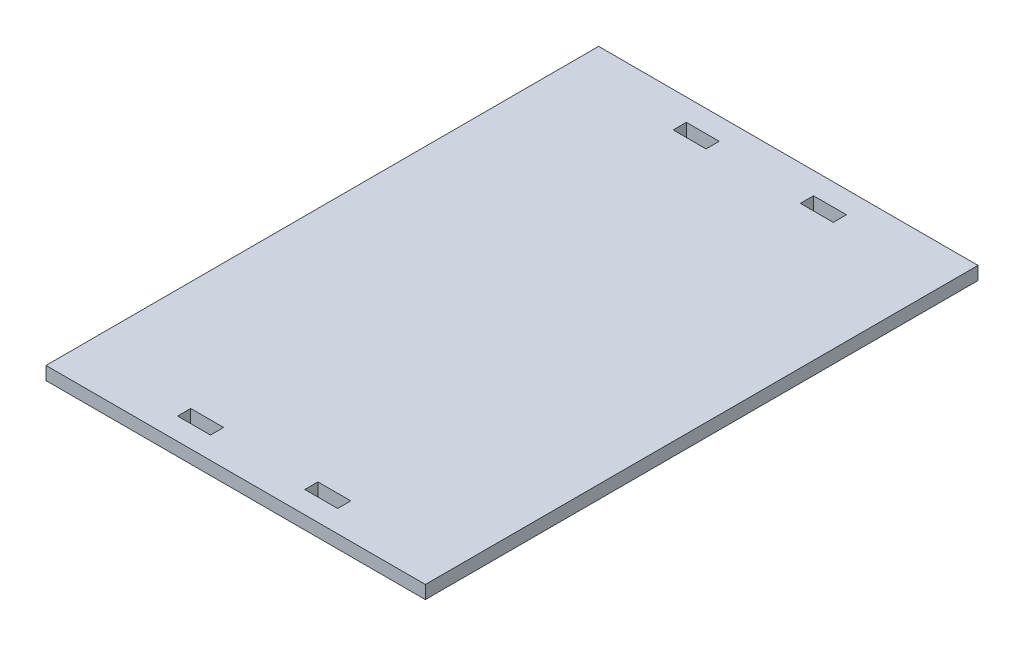
ISO-10303-21;
HEADER;
FILE_DESCRIPTION(('STEP AP214'),'2;1');
FILE_NAME('part.step','',(''),(''),'','','');
FILE_SCHEMA(('AUTOMOTIVE_DESIGN { 1 0 10303 214 1 1 1 1 }'));
ENDSEC;
DATA;
#1=APPLICATION_CONTEXT('core data for automotive mechanical design processes');
#2=APPLICATION_PROTOCOL_DEFINITION('international standard','automotive_design',2000,#1);
#3=PRODUCT_CONTEXT('',#1,'mechanical');
#4=PRODUCT('Part','Part','',(#3));
#5=PRODUCT_RELATED_PRODUCT_CATEGORY('part','',(#4));
#6=PRODUCT_DEFINITION_FORMATION('','',#4);
#7=PRODUCT_DEFINITION_CONTEXT('part definition',#1,'design');
#8=PRODUCT_DEFINITION('design','',#6,#7);
#9=PRODUCT_DEFINITION_SHAPE('','',#8);
#10=(LENGTH_UNIT() NAMED_UNIT(*) SI_UNIT(.MILLI.,.METRE.));
#11=(NAMED_UNIT(*) PLANE_ANGLE_UNIT() SI_UNIT($,.RADIAN.));
#12=(NAMED_UNIT(*) SI_UNIT($,.STERADIAN.) SOLID_ANGLE_UNIT());
#13=UNCERTAINTY_MEASURE_WITH_UNIT(LENGTH_MEASURE(1.E-05),#10,'distance_accuracy_value','');
#14=(GEOMETRIC_REPRESENTATION_CONTEXT(3) GLOBAL_UNCERTAINTY_ASSIGNED_CONTEXT((#13)) GLOBAL_UNIT_ASSIGNED_CONTEXT((#10,
#11,#12)) REPRESENTATION_CONTEXT('',''));
#15=CARTESIAN_POINT('',(0.,0.,0.));
#16=DIRECTION('',(0.,0.,1.));
#17=DIRECTION('',(1.,0.,0.));
#18=AXIS2_PLACEMENT_3D('',#15,#16,#17);
#19=CARTESIAN_POINT('',(0.,6.,0.));
#20=DIRECTION('',(0.,1.,0.));
#21=DIRECTION('',(0.,0.,1.));
#22=AXIS2_PLACEMENT_3D('',#19,#20,#21);
#23=PLANE('',#22);
#24=DIRECTION('',(0.,0.,-1.));
#25=VECTOR('',#24,1.);
#26=CARTESIAN_POINT('',(0.,6.,252.));
#27=LINE('',#26,#25);
#28=CARTESIAN_POINT('',(0.,6.,252.));
#29=VERTEX_POINT('',#28);
#30=CARTESIAN_POINT('',(0.,6.,0.));
#31=VERTEX_POINT('',#30);
#32=EDGE_CURVE('E305',#29,#31,#27,.T.);
#33=ORIENTED_EDGE('',*,*,#32,.T.);
#34=DIRECTION('',(-1.,0.,0.));
#35=VECTOR('',#34,1.);
#36=CARTESIAN_POINT('',(0.,6.,0.));
#37=LINE('',#36,#35);
#38=CARTESIAN_POINT('',(-173.,6.,0.));
#39=VERTEX_POINT('',#38);
#40=EDGE_CURVE('E308',#31,#39,#37,.T.);
#41=ORIENTED_EDGE('',*,*,#40,.T.);
#42=DIRECTION('',(0.,0.,1.));
#43=VECTOR('',#42,1.);
#44=CARTESIAN_POINT('',(-173.,6.,0.));
#45=LINE('',#44,#43);
#46=CARTESIAN_POINT('',(-173.,6.,252.));
#47=VERTEX_POINT('',#46);
#48=EDGE_CURVE('E311',#39,#47,#45,.T.);
#49=ORIENTED_EDGE('',*,*,#48,.T.);
#50=DIRECTION('',(1.,0.,0.));
#51=VECTOR('',#50,1.);
#52=CARTESIAN_POINT('',(-173.,6.,252.));
#53=LINE('',#52,#51);
#54=EDGE_CURVE('E313',#47,#29,#53,.T.);
#55=ORIENTED_EDGE('',*,*,#54,.T.);
#56=EDGE_LOOP('',(#33,#41,#49,#55));
#57=FACE_BOUND('',#56,.T.);
#58=DIRECTION('',(0.,0.,1.));
#59=VECTOR('',#58,1.);
#60=CARTESIAN_POINT('',(-123.,6.,10.));
#61=LINE('',#60,#59);
#62=CARTESIAN_POINT('',(-123.,6.,10.));
#63=VERTEX_POINT('',#62);
#64=CARTESIAN_POINT('',(-123.,6.,16.));
#65=VERTEX_POINT('',#64);
#66=EDGE_CURVE('E276',#63,#65,#61,.T.);
#67=ORIENTED_EDGE('',*,*,#66,.F.);
#68=DIRECTION('',(-1.,0.,0.));
#69=VECTOR('',#68,1.);
#70=CARTESIAN_POINT('',(-108.,6.,10.));
#71=LINE('',#70,#69);
#72=CARTESIAN_POINT('',(-108.,6.,10.));
#73=VERTEX_POINT('',#72);
#74=EDGE_CURVE('E274',#73,#63,#71,.T.);
#75=ORIENTED_EDGE('',*,*,#74,.F.);
#76=DIRECTION('',(0.,0.,-1.));
#77=VECTOR('',#76,1.);
#78=CARTESIAN_POINT('',(-108.,6.,10.));
#79=LINE('',#78,#77);
#80=CARTESIAN_POINT('',(-108.,6.,16.));
#81=VERTEX_POINT('',#80);
#82=EDGE_CURVE('E282',#81,#73,#79,.T.);
#83=ORIENTED_EDGE('',*,*,#82,.F.);
#84=DIRECTION('',(1.,0.,0.));
#85=VECTOR('',#84,1.);
#86=CARTESIAN_POINT('',(-123.,6.,16.));
#87=LINE('',#86,#85);
#88=EDGE_CURVE('E279',#65,#81,#87,.T.);
#89=ORIENTED_EDGE('',*,*,#88,.F.);
#90=EDGE_LOOP('',(#67,#75,#83,#89));
#91=FACE_BOUND('',#90,.T.);
#92=DIRECTION('',(0.,0.,-1.));
#93=VECTOR('',#92,1.);
#94=CARTESIAN_POINT('',(-50.,6.,10.));
#95=LINE('',#94,#93);
#96=CARTESIAN_POINT('',(-50.,6.,16.));
#97=VERTEX_POINT('',#96);
#98=CARTESIAN_POINT('',(-50.,6.,10.));
#99=VERTEX_POINT('',#98);
#100=EDGE_CURVE('E245',#97,#99,#95,.T.);
#101=ORIENTED_EDGE('',*,*,#100,.F.);
#102=DIRECTION('',(1.,0.,0.));
#103=VECTOR('',#102,1.);
#104=CARTESIAN_POINT('',(-50.,6.,16.));
#105=LINE('',#104,#103);
#106=CARTESIAN_POINT('',(-65.,6.,16.));
#107=VERTEX_POINT('',#106);
#108=EDGE_CURVE('E243',#107,#97,#105,.T.);
#109=ORIENTED_EDGE('',*,*,#108,.F.);
#110=DIRECTION('',(0.,0.,1.));
#111=VECTOR('',#110,1.);
#112=CARTESIAN_POINT('',(-65.,6.,16.));
#113=LINE('',#112,#111);
#114=CARTESIAN_POINT('',(-65.,6.,10.));
#115=VERTEX_POINT('',#114);
#116=EDGE_CURVE('E251',#115,#107,#113,.T.);
#117=ORIENTED_EDGE('',*,*,#116,.F.);
#118=DIRECTION('',(-1.,0.,0.));
#119=VECTOR('',#118,1.);
#120=CARTESIAN_POINT('',(-65.,6.,10.));
#121=LINE('',#120,#119);
#122=EDGE_CURVE('E248',#99,#115,#121,.T.);
#123=ORIENTED_EDGE('',*,*,#122,.F.);
#124=EDGE_LOOP('',(#101,#109,#117,#123));
#125=FACE_BOUND('',#124,.T.);
#126=DIRECTION('',(1.,0.,0.));
#127=VECTOR('',#126,1.);
#128=CARTESIAN_POINT('',(-123.,6.,242.000000000012));
#129=LINE('',#128,#127);
#130=CARTESIAN_POINT('',(-123.,6.,242.000000000012));
#131=VERTEX_POINT('',#130);
#132=CARTESIAN_POINT('',(-108.,6.,242.000000000012));
#133=VERTEX_POINT('',#132);
#134=EDGE_CURVE('E214',#131,#133,#129,.T.);
#135=ORIENTED_EDGE('',*,*,#134,.F.);
#136=DIRECTION('',(0.,0.,1.));
#137=VECTOR('',#136,1.);
#138=CARTESIAN_POINT('',(-123.,6.,236.000000000012));
#139=LINE('',#138,#137);
#140=CARTESIAN_POINT('',(-123.,6.,236.000000000012));
#141=VERTEX_POINT('',#140);
#142=EDGE_CURVE('E212',#141,#131,#139,.T.);
#143=ORIENTED_EDGE('',*,*,#142,.F.);
#144=DIRECTION('',(-1.,0.,0.));
#145=VECTOR('',#144,1.);
#146=CARTESIAN_POINT('',(-108.,6.,236.000000000012));
#147=LINE('',#146,#145);
#148=CARTESIAN_POINT('',(-108.,6.,236.000000000012));
#149=VERTEX_POINT('',#148);
#150=EDGE_CURVE('E220',#149,#141,#147,.T.);
#151=ORIENTED_EDGE('',*,*,#150,.F.);
#152=DIRECTION('',(0.,0.,-1.));
#153=VECTOR('',#152,1.);
#154=CARTESIAN_POINT('',(-108.,6.,236.000000000012));
#155=LINE('',#154,#153);
#156=EDGE_CURVE('E217',#133,#149,#155,.T.);
#157=ORIENTED_EDGE('',*,*,#156,.F.);
#158=EDGE_LOOP('',(#135,#143,#151,#157));
#159=FACE_BOUND('',#158,.T.);
#160=DIRECTION('',(0.,0.,-1.));
#161=VECTOR('',#160,1.);
#162=CARTESIAN_POINT('',(-50.,6.,236.000000000012));
#163=LINE('',#162,#161);
#164=CARTESIAN_POINT('',(-50.,6.,242.000000000012));
#165=VERTEX_POINT('',#164);
#166=CARTESIAN_POINT('',(-50.,6.,236.000000000012));
#167=VERTEX_POINT('',#166);
#168=EDGE_CURVE('E184',#165,#167,#163,.T.);
#169=ORIENTED_EDGE('',*,*,#168,.F.);
#170=DIRECTION('',(1.,0.,0.));
#171=VECTOR('',#170,1.);
#172=CARTESIAN_POINT('',(-50.,6.,242.000000000012));
#173=LINE('',#172,#171);
#174=CARTESIAN_POINT('',(-65.,6.,242.000000000012));
#175=VERTEX_POINT('',#174);
#176=EDGE_CURVE('E176',#175,#165,#173,.T.);
#177=ORIENTED_EDGE('',*,*,#176,.F.);
#178=DIRECTION('',(0.,0.,1.));
#179=VECTOR('',#178,1.);
#180=CARTESIAN_POINT('',(-65.,6.,242.000000000012));
#181=LINE('',#180,#179);
#182=CARTESIAN_POINT('',(-65.,6.,236.000000000012));
#183=VERTEX_POINT('',#182);
#184=EDGE_CURVE('E198',#183,#175,#181,.T.);
#185=ORIENTED_EDGE('',*,*,#184,.F.);
#186=DIRECTION('',(-1.,0.,0.));
#187=VECTOR('',#186,1.);
#188=CARTESIAN_POINT('',(-65.,6.,236.000000000012));
#189=LINE('',#188,#187);
#190=EDGE_CURVE('E196',#167,#183,#189,.T.);
#191=ORIENTED_EDGE('',*,*,#190,.F.);
#192=EDGE_LOOP('',(#169,#177,#185,#191));
#193=FACE_BOUND('',#192,.T.);
#194=ADVANCED_FACE('F39',(#57,#91,#125,#159,#193),#23,.T.);
#195=CARTESIAN_POINT('',(0.,0.,0.));
#196=DIRECTION('',(0.,1.,0.));
#197=DIRECTION('',(0.,0.,1.));
#198=AXIS2_PLACEMENT_3D('',#195,#196,#197);
#199=PLANE('',#198);
#200=DIRECTION('',(0.,0.,1.));
#201=VECTOR('',#200,1.);
#202=CARTESIAN_POINT('',(-123.,0.,236.000000000012));
#203=LINE('',#202,#201);
#204=CARTESIAN_POINT('',(-123.,0.,236.000000000012));
#205=VERTEX_POINT('',#204);
#206=CARTESIAN_POINT('',(-123.,0.,242.000000000012));
#207=VERTEX_POINT('',#206);
#208=EDGE_CURVE('E192',#205,#207,#203,.T.);
#209=ORIENTED_EDGE('',*,*,#208,.T.);
#210=DIRECTION('',(1.,0.,0.));
#211=VECTOR('',#210,1.);
#212=CARTESIAN_POINT('',(-123.,0.,242.000000000012));
#213=LINE('',#212,#211);
#214=CARTESIAN_POINT('',(-108.,0.,242.000000000012));
#215=VERTEX_POINT('',#214);
#216=EDGE_CURVE('E225',#207,#215,#213,.T.);
#217=ORIENTED_EDGE('',*,*,#216,.T.);
#218=DIRECTION('',(0.,0.,-1.));
#219=VECTOR('',#218,1.);
#220=CARTESIAN_POINT('',(-108.,0.,236.000000000012));
#221=LINE('',#220,#219);
#222=CARTESIAN_POINT('',(-108.,0.,236.000000000012));
#223=VERTEX_POINT('',#222);
#224=EDGE_CURVE('E228',#215,#223,#221,.T.);
#225=ORIENTED_EDGE('',*,*,#224,.T.);
#226=DIRECTION('',(-1.,0.,0.));
#227=VECTOR('',#226,1.);
#228=CARTESIAN_POINT('',(-108.,0.,236.000000000012));
#229=LINE('',#228,#227);
#230=EDGE_CURVE('E215',#223,#205,#229,.T.);
#231=ORIENTED_EDGE('',*,*,#230,.T.);
#232=EDGE_LOOP('',(#209,#217,#225,#231));
#233=FACE_BOUND('',#232,.T.);
#234=DIRECTION('',(-1.,0.,0.));
#235=VECTOR('',#234,1.);
#236=CARTESIAN_POINT('',(-108.,0.,10.));
#237=LINE('',#236,#235);
#238=CARTESIAN_POINT('',(-108.,0.,10.));
#239=VERTEX_POINT('',#238);
#240=CARTESIAN_POINT('',(-123.,0.,10.));
#241=VERTEX_POINT('',#240);
#242=EDGE_CURVE('E273',#239,#241,#237,.T.);
#243=ORIENTED_EDGE('',*,*,#242,.T.);
#244=DIRECTION('',(0.,0.,1.));
#245=VECTOR('',#244,1.);
#246=CARTESIAN_POINT('',(-123.,0.,10.));
#247=LINE('',#246,#245);
#248=CARTESIAN_POINT('',(-123.,0.,16.));
#249=VERTEX_POINT('',#248);
#250=EDGE_CURVE('E287',#241,#249,#247,.T.);
#251=ORIENTED_EDGE('',*,*,#250,.T.);
#252=DIRECTION('',(1.,0.,0.));
#253=VECTOR('',#252,1.);
#254=CARTESIAN_POINT('',(-123.,0.,16.));
#255=LINE('',#254,#253);
#256=CARTESIAN_POINT('',(-108.,0.,16.));
#257=VERTEX_POINT('',#256);
#258=EDGE_CURVE('E290',#249,#257,#255,.T.);
#259=ORIENTED_EDGE('',*,*,#258,.T.);
#260=DIRECTION('',(0.,0.,-1.));
#261=VECTOR('',#260,1.);
#262=CARTESIAN_POINT('',(-108.,0.,10.));
#263=LINE('',#262,#261);
#264=EDGE_CURVE('E277',#257,#239,#263,.T.);
#265=ORIENTED_EDGE('',*,*,#264,.T.);
#266=EDGE_LOOP('',(#243,#251,#259,#265));
#267=FACE_BOUND('',#266,.T.);
#268=DIRECTION('',(0.,0.,-1.));
#269=VECTOR('',#268,1.);
#270=CARTESIAN_POINT('',(0.,0.,252.));
#271=LINE('',#270,#269);
#272=CARTESIAN_POINT('',(0.,0.,252.));
#273=VERTEX_POINT('',#272);
#274=CARTESIAN_POINT('',(0.,0.,0.));
#275=VERTEX_POINT('',#274);
#276=EDGE_CURVE('E304',#273,#275,#271,.T.);
#277=ORIENTED_EDGE('',*,*,#276,.F.);
#278=DIRECTION('',(1.,0.,0.));
#279=VECTOR('',#278,1.);
#280=CARTESIAN_POINT('',(-173.,0.,252.));
#281=LINE('',#280,#279);
#282=CARTESIAN_POINT('',(-173.,0.,252.));
#283=VERTEX_POINT('',#282);
#284=EDGE_CURVE('E309',#283,#273,#281,.T.);
#285=ORIENTED_EDGE('',*,*,#284,.F.);
#286=DIRECTION('',(0.,0.,1.));
#287=VECTOR('',#286,1.);
#288=CARTESIAN_POINT('',(-173.,0.,0.));
#289=LINE('',#288,#287);
#290=CARTESIAN_POINT('',(-173.,0.,0.));
#291=VERTEX_POINT('',#290);
#292=EDGE_CURVE('E320',#291,#283,#289,.T.);
#293=ORIENTED_EDGE('',*,*,#292,.F.);
#294=DIRECTION('',(-1.,0.,0.));
#295=VECTOR('',#294,1.);
#296=CARTESIAN_POINT('',(0.,0.,0.));
#297=LINE('',#296,#295);
#298=EDGE_CURVE('E318',#275,#291,#297,.T.);
#299=ORIENTED_EDGE('',*,*,#298,.F.);
#300=EDGE_LOOP('',(#277,#285,#293,#299));
#301=FACE_BOUND('',#300,.T.);
#302=DIRECTION('',(1.,0.,0.));
#303=VECTOR('',#302,1.);
#304=CARTESIAN_POINT('',(-50.,0.,16.));
#305=LINE('',#304,#303);
#306=CARTESIAN_POINT('',(-65.,0.,16.));
#307=VERTEX_POINT('',#306);
#308=CARTESIAN_POINT('',(-50.,0.,16.));
#309=VERTEX_POINT('',#308);
#310=EDGE_CURVE('E242',#307,#309,#305,.T.);
#311=ORIENTED_EDGE('',*,*,#310,.T.);
#312=DIRECTION('',(0.,0.,-1.));
#313=VECTOR('',#312,1.);
#314=CARTESIAN_POINT('',(-50.,0.,10.));
#315=LINE('',#314,#313);
#316=CARTESIAN_POINT('',(-50.,0.,10.));
#317=VERTEX_POINT('',#316);
#318=EDGE_CURVE('E256',#309,#317,#315,.T.);
#319=ORIENTED_EDGE('',*,*,#318,.T.);
#320=DIRECTION('',(-1.,0.,0.));
#321=VECTOR('',#320,1.);
#322=CARTESIAN_POINT('',(-65.,0.,10.));
#323=LINE('',#322,#321);
#324=CARTESIAN_POINT('',(-65.,0.,10.));
#325=VERTEX_POINT('',#324);
#326=EDGE_CURVE('E259',#317,#325,#323,.T.);
#327=ORIENTED_EDGE('',*,*,#326,.T.);
#328=DIRECTION('',(0.,0.,1.));
#329=VECTOR('',#328,1.);
#330=CARTESIAN_POINT('',(-65.,0.,16.));
#331=LINE('',#330,#329);
#332=EDGE_CURVE('E246',#325,#307,#331,.T.);
#333=ORIENTED_EDGE('',*,*,#332,.T.);
#334=EDGE_LOOP('',(#311,#319,#327,#333));
#335=FACE_BOUND('',#334,.T.);
#336=DIRECTION('',(1.,0.,0.));
#337=VECTOR('',#336,1.);
#338=CARTESIAN_POINT('',(-50.,0.,242.000000000012));
#339=LINE('',#338,#337);
#340=CARTESIAN_POINT('',(-65.,0.,242.000000000012));
#341=VERTEX_POINT('',#340);
#342=CARTESIAN_POINT('',(-50.,0.,242.000000000012));
#343=VERTEX_POINT('',#342);
#344=EDGE_CURVE('E62',#341,#343,#339,.T.);
#345=ORIENTED_EDGE('',*,*,#344,.T.);
#346=DIRECTION('',(0.,0.,-1.));
#347=VECTOR('',#346,1.);
#348=CARTESIAN_POINT('',(-50.,0.,236.000000000012));
#349=LINE('',#348,#347);
#350=CARTESIAN_POINT('',(-50.,0.,236.000000000012));
#351=VERTEX_POINT('',#350);
#352=EDGE_CURVE('E191',#343,#351,#349,.T.);
#353=ORIENTED_EDGE('',*,*,#352,.T.);
#354=DIRECTION('',(-1.,0.,0.));
#355=VECTOR('',#354,1.);
#356=CARTESIAN_POINT('',(-65.,0.,236.000000000012));
#357=LINE('',#356,#355);
#358=CARTESIAN_POINT('',(-65.,0.,236.000000000012));
#359=VERTEX_POINT('',#358);
#360=EDGE_CURVE('E204',#351,#359,#357,.T.);
#361=ORIENTED_EDGE('',*,*,#360,.T.);
#362=DIRECTION('',(0.,0.,1.));
#363=VECTOR('',#362,1.);
#364=CARTESIAN_POINT('',(-65.,0.,242.000000000012));
#365=LINE('',#364,#363);
#366=EDGE_CURVE('E185',#359,#341,#365,.T.);
#367=ORIENTED_EDGE('',*,*,#366,.T.);
#368=EDGE_LOOP('',(#345,#353,#361,#367));
#369=FACE_BOUND('',#368,.T.);
#370=ADVANCED_FACE('F338',(#233,#267,#301,#335,#369),#199,.F.);
#371=CARTESIAN_POINT('',(0.,6.,252.));
#372=DIRECTION('',(-1.,0.,0.));
#373=DIRECTION('',(0.,0.,1.));
#374=AXIS2_PLACEMENT_3D('',#371,#372,#373);
#375=PLANE('',#374);
#376=ORIENTED_EDGE('',*,*,#276,.T.);
#377=DIRECTION('',(0.,-1.,0.));
#378=VECTOR('',#377,1.);
#379=CARTESIAN_POINT('',(0.,6.,0.));
#380=LINE('',#379,#378);
#381=EDGE_CURVE('E11',#31,#275,#380,.T.);
#382=ORIENTED_EDGE('',*,*,#381,.F.);
#383=ORIENTED_EDGE('',*,*,#32,.F.);
#384=DIRECTION('',(0.,-1.,0.));
#385=VECTOR('',#384,1.);
#386=CARTESIAN_POINT('',(0.,6.,252.));
#387=LINE('',#386,#385);
#388=EDGE_CURVE('E315',#29,#273,#387,.T.);
#389=ORIENTED_EDGE('',*,*,#388,.T.);
#390=EDGE_LOOP('',(#376,#382,#383,#389));
#391=FACE_BOUND('',#390,.T.);
#392=ADVANCED_FACE('F41',(#391),#375,.F.);
#393=CARTESIAN_POINT('',(0.,6.,0.));
#394=DIRECTION('',(0.,0.,1.));
#395=DIRECTION('',(1.,0.,0.));
#396=AXIS2_PLACEMENT_3D('',#393,#394,#395);
#397=PLANE('',#396);
#398=ORIENTED_EDGE('',*,*,#298,.T.);
#399=DIRECTION('',(0.,-1.,0.));
#400=VECTOR('',#399,1.);
#401=CARTESIAN_POINT('',(-173.,6.,0.));
#402=LINE('',#401,#400);
#403=EDGE_CURVE('E47',#39,#291,#402,.T.);
#404=ORIENTED_EDGE('',*,*,#403,.F.);
#405=ORIENTED_EDGE('',*,*,#40,.F.);
#406=ORIENTED_EDGE('',*,*,#381,.T.);
#407=EDGE_LOOP('',(#398,#404,#405,#406));
#408=FACE_BOUND('',#407,.T.);
#409=ADVANCED_FACE('F349',(#408),#397,.F.);
#410=CARTESIAN_POINT('',(-173.,6.,0.));
#411=DIRECTION('',(1.,0.,0.));
#412=DIRECTION('',(0.,0.,-1.));
#413=AXIS2_PLACEMENT_3D('',#410,#411,#412);
#414=PLANE('',#413);
#415=ORIENTED_EDGE('',*,*,#292,.T.);
#416=DIRECTION('',(0.,-1.,0.));
#417=VECTOR('',#416,1.);
#418=CARTESIAN_POINT('',(-173.,6.,252.));
#419=LINE('',#418,#417);
#420=EDGE_CURVE('E325',#47,#283,#419,.T.);
#421=ORIENTED_EDGE('',*,*,#420,.F.);
#422=ORIENTED_EDGE('',*,*,#48,.F.);
#423=ORIENTED_EDGE('',*,*,#403,.T.);
#424=EDGE_LOOP('',(#415,#421,#422,#423));
#425=FACE_BOUND('',#424,.T.);
#426=ADVANCED_FACE('F332',(#425),#414,.F.);
#427=CARTESIAN_POINT('',(-173.,6.,252.));
#428=DIRECTION('',(0.,0.,-1.));
#429=DIRECTION('',(-1.,0.,0.));
#430=AXIS2_PLACEMENT_3D('',#427,#428,#429);
#431=PLANE('',#430);
#432=ORIENTED_EDGE('',*,*,#284,.T.);
#433=ORIENTED_EDGE('',*,*,#388,.F.);
#434=ORIENTED_EDGE('',*,*,#54,.F.);
#435=ORIENTED_EDGE('',*,*,#420,.T.);
#436=EDGE_LOOP('',(#432,#433,#434,#435));
#437=FACE_BOUND('',#436,.T.);
#438=ADVANCED_FACE('F342',(#437),#431,.F.);
#439=CARTESIAN_POINT('',(-108.,6.,10.));
#440=DIRECTION('',(0.,0.,1.));
#441=DIRECTION('',(1.,0.,0.));
#442=AXIS2_PLACEMENT_3D('',#439,#440,#441);
#443=PLANE('',#442);
#444=ORIENTED_EDGE('',*,*,#242,.F.);
#445=DIRECTION('',(0.,-1.,0.));
#446=VECTOR('',#445,1.);
#447=CARTESIAN_POINT('',(-108.,6.,10.));
#448=LINE('',#447,#446);
#449=EDGE_CURVE('E284',#73,#239,#448,.T.);
#450=ORIENTED_EDGE('',*,*,#449,.F.);
#451=ORIENTED_EDGE('',*,*,#74,.T.);
#452=DIRECTION('',(0.,-1.,0.));
#453=VECTOR('',#452,1.);
#454=CARTESIAN_POINT('',(-123.,6.,10.));
#455=LINE('',#454,#453);
#456=EDGE_CURVE('E301',#63,#241,#455,.T.);
#457=ORIENTED_EDGE('',*,*,#456,.T.);
#458=EDGE_LOOP('',(#444,#450,#451,#457));
#459=FACE_BOUND('',#458,.T.);
#460=ADVANCED_FACE('F364',(#459),#443,.T.);
#461=CARTESIAN_POINT('',(-123.,6.,10.));
#462=DIRECTION('',(1.,0.,0.));
#463=DIRECTION('',(0.,0.,-1.));
#464=AXIS2_PLACEMENT_3D('',#461,#462,#463);
#465=PLANE('',#464);
#466=ORIENTED_EDGE('',*,*,#250,.F.);
#467=ORIENTED_EDGE('',*,*,#456,.F.);
#468=ORIENTED_EDGE('',*,*,#66,.T.);
#469=DIRECTION('',(0.,-1.,0.));
#470=VECTOR('',#469,1.);
#471=CARTESIAN_POINT('',(-123.,6.,16.));
#472=LINE('',#471,#470);
#473=EDGE_CURVE('E299',#65,#249,#472,.T.);
#474=ORIENTED_EDGE('',*,*,#473,.T.);
#475=EDGE_LOOP('',(#466,#467,#468,#474));
#476=FACE_BOUND('',#475,.T.);
#477=ADVANCED_FACE('F371',(#476),#465,.T.);
#478=CARTESIAN_POINT('',(-123.,6.,16.));
#479=DIRECTION('',(0.,0.,-1.));
#480=DIRECTION('',(-1.,0.,0.));
#481=AXIS2_PLACEMENT_3D('',#478,#479,#480);
#482=PLANE('',#481);
#483=ORIENTED_EDGE('',*,*,#258,.F.);
#484=ORIENTED_EDGE('',*,*,#473,.F.);
#485=ORIENTED_EDGE('',*,*,#88,.T.);
#486=DIRECTION('',(0.,-1.,0.));
#487=VECTOR('',#486,1.);
#488=CARTESIAN_POINT('',(-108.,6.,16.));
#489=LINE('',#488,#487);
#490=EDGE_CURVE('E297',#81,#257,#489,.T.);
#491=ORIENTED_EDGE('',*,*,#490,.T.);
#492=EDGE_LOOP('',(#483,#484,#485,#491));
#493=FACE_BOUND('',#492,.T.);
#494=ADVANCED_FACE('F376',(#493),#482,.T.);
#495=CARTESIAN_POINT('',(-108.,6.,10.));
#496=DIRECTION('',(-1.,0.,0.));
#497=DIRECTION('',(0.,0.,1.));
#498=AXIS2_PLACEMENT_3D('',#495,#496,#497);
#499=PLANE('',#498);
#500=ORIENTED_EDGE('',*,*,#264,.F.);
#501=ORIENTED_EDGE('',*,*,#490,.F.);
#502=ORIENTED_EDGE('',*,*,#82,.T.);
#503=ORIENTED_EDGE('',*,*,#449,.T.);
#504=EDGE_LOOP('',(#500,#501,#502,#503));
#505=FACE_BOUND('',#504,.T.);
#506=ADVANCED_FACE('F384',(#505),#499,.T.);
#507=CARTESIAN_POINT('',(-50.,6.,16.));
#508=DIRECTION('',(0.,0.,-1.));
#509=DIRECTION('',(-1.,0.,0.));
#510=AXIS2_PLACEMENT_3D('',#507,#508,#509);
#511=PLANE('',#510);
#512=ORIENTED_EDGE('',*,*,#310,.F.);
#513=DIRECTION('',(0.,-1.,0.));
#514=VECTOR('',#513,1.);
#515=CARTESIAN_POINT('',(-65.,6.,16.));
#516=LINE('',#515,#514);
#517=EDGE_CURVE('E253',#107,#307,#516,.T.);
#518=ORIENTED_EDGE('',*,*,#517,.F.);
#519=ORIENTED_EDGE('',*,*,#108,.T.);
#520=DIRECTION('',(0.,-1.,0.));
#521=VECTOR('',#520,1.);
#522=CARTESIAN_POINT('',(-50.,6.,16.));
#523=LINE('',#522,#521);
#524=EDGE_CURVE('E270',#97,#309,#523,.T.);
#525=ORIENTED_EDGE('',*,*,#524,.T.);
#526=EDGE_LOOP('',(#512,#518,#519,#525));
#527=FACE_BOUND('',#526,.T.);
#528=ADVANCED_FACE('F438',(#527),#511,.T.);
#529=CARTESIAN_POINT('',(-50.,6.,10.));
#530=DIRECTION('',(-1.,0.,0.));
#531=DIRECTION('',(0.,0.,1.));
#532=AXIS2_PLACEMENT_3D('',#529,#530,#531);
#533=PLANE('',#532);
#534=ORIENTED_EDGE('',*,*,#318,.F.);
#535=ORIENTED_EDGE('',*,*,#524,.F.);
#536=ORIENTED_EDGE('',*,*,#100,.T.);
#537=DIRECTION('',(0.,-1.,0.));
#538=VECTOR('',#537,1.);
#539=CARTESIAN_POINT('',(-50.,6.,10.));
#540=LINE('',#539,#538);
#541=EDGE_CURVE('E268',#99,#317,#540,.T.);
#542=ORIENTED_EDGE('',*,*,#541,.T.);
#543=EDGE_LOOP('',(#534,#535,#536,#542));
#544=FACE_BOUND('',#543,.T.);
#545=ADVANCED_FACE('F434',(#544),#533,.T.);
#546=CARTESIAN_POINT('',(-65.,6.,10.));
#547=DIRECTION('',(0.,0.,1.));
#548=DIRECTION('',(1.,0.,0.));
#549=AXIS2_PLACEMENT_3D('',#546,#547,#548);
#550=PLANE('',#549);
#551=ORIENTED_EDGE('',*,*,#326,.F.);
#552=ORIENTED_EDGE('',*,*,#541,.F.);
#553=ORIENTED_EDGE('',*,*,#122,.T.);
#554=DIRECTION('',(0.,-1.,0.));
#555=VECTOR('',#554,1.);
#556=CARTESIAN_POINT('',(-65.,6.,10.));
#557=LINE('',#556,#555);
#558=EDGE_CURVE('E266',#115,#325,#557,.T.);
#559=ORIENTED_EDGE('',*,*,#558,.T.);
#560=EDGE_LOOP('',(#551,#552,#553,#559));
#561=FACE_BOUND('',#560,.T.);
#562=ADVANCED_FACE('F430',(#561),#550,.T.);
#563=CARTESIAN_POINT('',(-65.,6.,16.));
#564=DIRECTION('',(1.,0.,0.));
#565=DIRECTION('',(0.,0.,-1.));
#566=AXIS2_PLACEMENT_3D('',#563,#564,#565);
#567=PLANE('',#566);
#568=ORIENTED_EDGE('',*,*,#332,.F.);
#569=ORIENTED_EDGE('',*,*,#558,.F.);
#570=ORIENTED_EDGE('',*,*,#116,.T.);
#571=ORIENTED_EDGE('',*,*,#517,.T.);
#572=EDGE_LOOP('',(#568,#569,#570,#571));
#573=FACE_BOUND('',#572,.T.);
#574=ADVANCED_FACE('F427',(#573),#567,.T.);
#575=CARTESIAN_POINT('',(-123.,6.,236.000000000012));
#576=DIRECTION('',(1.,0.,0.));
#577=DIRECTION('',(0.,0.,-1.));
#578=AXIS2_PLACEMENT_3D('',#575,#576,#577);
#579=PLANE('',#578);
#580=ORIENTED_EDGE('',*,*,#208,.F.);
#581=DIRECTION('',(0.,-1.,0.));
#582=VECTOR('',#581,1.);
#583=CARTESIAN_POINT('',(-123.,6.,236.000000000012));
#584=LINE('',#583,#582);
#585=EDGE_CURVE('E222',#141,#205,#584,.T.);
#586=ORIENTED_EDGE('',*,*,#585,.F.);
#587=ORIENTED_EDGE('',*,*,#142,.T.);
#588=DIRECTION('',(0.,-1.,0.));
#589=VECTOR('',#588,1.);
#590=CARTESIAN_POINT('',(-123.,6.,242.000000000012));
#591=LINE('',#590,#589);
#592=EDGE_CURVE('E239',#131,#207,#591,.T.);
#593=ORIENTED_EDGE('',*,*,#592,.T.);
#594=EDGE_LOOP('',(#580,#586,#587,#593));
#595=FACE_BOUND('',#594,.T.);
#596=ADVANCED_FACE('F409',(#595),#579,.T.);
#597=CARTESIAN_POINT('',(-123.,6.,242.000000000012));
#598=DIRECTION('',(0.,0.,-1.));
#599=DIRECTION('',(-1.,0.,0.));
#600=AXIS2_PLACEMENT_3D('',#597,#598,#599);
#601=PLANE('',#600);
#602=ORIENTED_EDGE('',*,*,#216,.F.);
#603=ORIENTED_EDGE('',*,*,#592,.F.);
#604=ORIENTED_EDGE('',*,*,#134,.T.);
#605=DIRECTION('',(0.,-1.,0.));
#606=VECTOR('',#605,1.);
#607=CARTESIAN_POINT('',(-108.,6.,242.000000000012));
#608=LINE('',#607,#606);
#609=EDGE_CURVE('E237',#133,#215,#608,.T.);
#610=ORIENTED_EDGE('',*,*,#609,.T.);
#611=EDGE_LOOP('',(#602,#603,#604,#610));
#612=FACE_BOUND('',#611,.T.);
#613=ADVANCED_FACE('F403',(#612),#601,.T.);
#614=CARTESIAN_POINT('',(-108.,6.,236.000000000012));
#615=DIRECTION('',(-1.,0.,0.));
#616=DIRECTION('',(0.,0.,1.));
#617=AXIS2_PLACEMENT_3D('',#614,#615,#616);
#618=PLANE('',#617);
#619=ORIENTED_EDGE('',*,*,#224,.F.);
#620=ORIENTED_EDGE('',*,*,#609,.F.);
#621=ORIENTED_EDGE('',*,*,#156,.T.);
#622=DIRECTION('',(0.,-1.,0.));
#623=VECTOR('',#622,1.);
#624=CARTESIAN_POINT('',(-108.,6.,236.000000000012));
#625=LINE('',#624,#623);
#626=EDGE_CURVE('E235',#149,#223,#625,.T.);
#627=ORIENTED_EDGE('',*,*,#626,.T.);
#628=EDGE_LOOP('',(#619,#620,#621,#627));
#629=FACE_BOUND('',#628,.T.);
#630=ADVANCED_FACE('F406',(#629),#618,.T.);
#631=CARTESIAN_POINT('',(-108.,6.,236.000000000012));
#632=DIRECTION('',(0.,0.,1.));
#633=DIRECTION('',(1.,0.,0.));
#634=AXIS2_PLACEMENT_3D('',#631,#632,#633);
#635=PLANE('',#634);
#636=ORIENTED_EDGE('',*,*,#230,.F.);
#637=ORIENTED_EDGE('',*,*,#626,.F.);
#638=ORIENTED_EDGE('',*,*,#150,.T.);
#639=ORIENTED_EDGE('',*,*,#585,.T.);
#640=EDGE_LOOP('',(#636,#637,#638,#639));
#641=FACE_BOUND('',#640,.T.);
#642=ADVANCED_FACE('F412',(#641),#635,.T.);
#643=CARTESIAN_POINT('',(-50.,6.,242.000000000012));
#644=DIRECTION('',(0.,0.,-1.));
#645=DIRECTION('',(-1.,0.,0.));
#646=AXIS2_PLACEMENT_3D('',#643,#644,#645);
#647=PLANE('',#646);
#648=ORIENTED_EDGE('',*,*,#344,.F.);
#649=DIRECTION('',(0.,-1.,0.));
#650=VECTOR('',#649,1.);
#651=CARTESIAN_POINT('',(-65.,6.,242.000000000012));
#652=LINE('',#651,#650);
#653=EDGE_CURVE('E180',#175,#341,#652,.T.);
#654=ORIENTED_EDGE('',*,*,#653,.F.);
#655=ORIENTED_EDGE('',*,*,#176,.T.);
#656=DIRECTION('',(0.,-1.,0.));
#657=VECTOR('',#656,1.);
#658=CARTESIAN_POINT('',(-50.,6.,242.000000000012));
#659=LINE('',#658,#657);
#660=EDGE_CURVE('E179',#165,#343,#659,.T.);
#661=ORIENTED_EDGE('',*,*,#660,.T.);
#662=EDGE_LOOP('',(#648,#654,#655,#661));
#663=FACE_BOUND('',#662,.T.);
#664=ADVANCED_FACE('F178',(#663),#647,.T.);
#665=CARTESIAN_POINT('',(-50.,6.,236.000000000012));
#666=DIRECTION('',(-1.,0.,0.));
#667=DIRECTION('',(0.,0.,1.));
#668=AXIS2_PLACEMENT_3D('',#665,#666,#667);
#669=PLANE('',#668);
#670=ORIENTED_EDGE('',*,*,#352,.F.);
#671=ORIENTED_EDGE('',*,*,#660,.F.);
#672=ORIENTED_EDGE('',*,*,#168,.T.);
#673=DIRECTION('',(0.,-1.,0.));
#674=VECTOR('',#673,1.);
#675=CARTESIAN_POINT('',(-50.,6.,236.000000000012));
#676=LINE('',#675,#674);
#677=EDGE_CURVE('E193',#167,#351,#676,.T.);
#678=ORIENTED_EDGE('',*,*,#677,.T.);
#679=EDGE_LOOP('',(#670,#671,#672,#678));
#680=FACE_BOUND('',#679,.T.);
#681=ADVANCED_FACE('F188',(#680),#669,.T.);
#682=CARTESIAN_POINT('',(-65.,6.,236.000000000012));
#683=DIRECTION('',(0.,0.,1.));
#684=DIRECTION('',(1.,0.,0.));
#685=AXIS2_PLACEMENT_3D('',#682,#683,#684);
#686=PLANE('',#685);
#687=ORIENTED_EDGE('',*,*,#360,.F.);
#688=ORIENTED_EDGE('',*,*,#677,.F.);
#689=ORIENTED_EDGE('',*,*,#190,.T.);
#690=DIRECTION('',(0.,-1.,0.));
#691=VECTOR('',#690,1.);
#692=CARTESIAN_POINT('',(-65.,6.,236.000000000012));
#693=LINE('',#692,#691);
#694=EDGE_CURVE('E54',#183,#359,#693,.T.);
#695=ORIENTED_EDGE('',*,*,#694,.T.);
#696=EDGE_LOOP('',(#687,#688,#689,#695));
#697=FACE_BOUND('',#696,.T.);
#698=ADVANCED_FACE('F510',(#697),#686,.T.);
#699=CARTESIAN_POINT('',(-65.,6.,242.000000000012));
#700=DIRECTION('',(1.,0.,0.));
#701=DIRECTION('',(0.,0.,-1.));
#702=AXIS2_PLACEMENT_3D('',#699,#700,#701);
#703=PLANE('',#702);
#704=ORIENTED_EDGE('',*,*,#366,.F.);
#705=ORIENTED_EDGE('',*,*,#694,.F.);
#706=ORIENTED_EDGE('',*,*,#184,.T.);
#707=ORIENTED_EDGE('',*,*,#653,.T.);
#708=EDGE_LOOP('',(#704,#705,#706,#707));
#709=FACE_BOUND('',#708,.T.);
#710=ADVANCED_FACE('F518',(#709),#703,.T.);
#711=CLOSED_SHELL('',(#194,#370,#392,#409,#426,#438,#460,#477,#494,#506,#528,#545,#562,#574,
#596,#613,#630,#642,#664,#681,#698,#710));
#712=MANIFOLD_SOLID_BREP('B2',#711);
#713=ADVANCED_BREP_SHAPE_REPRESENTATION('',(#18,#712),#14);
#714=SHAPE_DEFINITION_REPRESENTATION(#9,#713);
ENDSEC;
END-ISO-10303-21;
